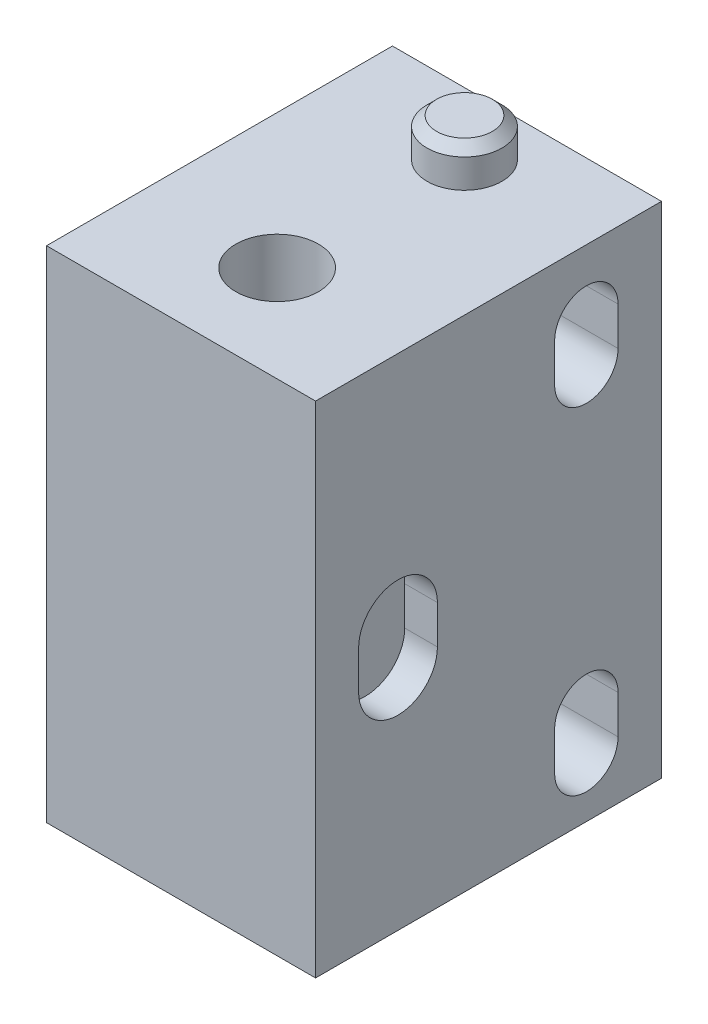
ISO-10303-21;
HEADER;
FILE_DESCRIPTION(('STEP AP214'),'2;1');
FILE_NAME('part.step','',(''),(''),'','','');
FILE_SCHEMA(('AUTOMOTIVE_DESIGN { 1 0 10303 214 1 1 1 1 }'));
ENDSEC;
DATA;
#1=APPLICATION_CONTEXT('core data for automotive mechanical design processes');
#2=APPLICATION_PROTOCOL_DEFINITION('international standard','automotive_design',2000,#1);
#3=PRODUCT_CONTEXT('',#1,'mechanical');
#4=PRODUCT('Part','Part','',(#3));
#5=PRODUCT_RELATED_PRODUCT_CATEGORY('part','',(#4));
#6=PRODUCT_DEFINITION_FORMATION('','',#4);
#7=PRODUCT_DEFINITION_CONTEXT('part definition',#1,'design');
#8=PRODUCT_DEFINITION('design','',#6,#7);
#9=PRODUCT_DEFINITION_SHAPE('','',#8);
#10=(LENGTH_UNIT() NAMED_UNIT(*) SI_UNIT(.MILLI.,.METRE.));
#11=(NAMED_UNIT(*) PLANE_ANGLE_UNIT() SI_UNIT($,.RADIAN.));
#12=(NAMED_UNIT(*) SI_UNIT($,.STERADIAN.) SOLID_ANGLE_UNIT());
#13=UNCERTAINTY_MEASURE_WITH_UNIT(LENGTH_MEASURE(1.E-05),#10,'distance_accuracy_value','');
#14=(GEOMETRIC_REPRESENTATION_CONTEXT(3) GLOBAL_UNCERTAINTY_ASSIGNED_CONTEXT((#13)) GLOBAL_UNIT_ASSIGNED_CONTEXT((#10,
#11,#12)) REPRESENTATION_CONTEXT('',''));
#15=CARTESIAN_POINT('',(0.,0.,0.));
#16=DIRECTION('',(0.,0.,1.));
#17=DIRECTION('',(1.,0.,0.));
#18=AXIS2_PLACEMENT_3D('',#15,#16,#17);
#19=CARTESIAN_POINT('',(19.,11.75,0.71));
#20=DIRECTION('',(-1.,0.,0.));
#21=DIRECTION('',(0.,0.,1.));
#22=AXIS2_PLACEMENT_3D('',#19,#20,#21);
#23=CYLINDRICAL_SURFACE('',#22,2.05);
#24=CARTESIAN_POINT('',(5.3,11.75,0.71));
#25=DIRECTION('',(-1.,0.,0.));
#26=DIRECTION('',(0.,0.,1.));
#27=AXIS2_PLACEMENT_3D('',#24,#25,#26);
#28=CIRCLE('',#27,2.05);
#29=CARTESIAN_POINT('',(5.3,11.75,-1.34));
#30=VERTEX_POINT('',#29);
#31=CARTESIAN_POINT('',(5.3,11.75,2.76));
#32=VERTEX_POINT('',#31);
#33=EDGE_CURVE('E185',#30,#32,#28,.T.);
#34=ORIENTED_EDGE('',*,*,#33,.T.);
#35=DIRECTION('',(-1.,0.,0.));
#36=VECTOR('',#35,1.);
#37=CARTESIAN_POINT('',(19.,11.75,2.76));
#38=LINE('',#37,#36);
#39=CARTESIAN_POINT('',(7.,11.75,2.76));
#40=VERTEX_POINT('',#39);
#41=EDGE_CURVE('E170',#40,#32,#38,.T.);
#42=ORIENTED_EDGE('',*,*,#41,.F.);
#43=CARTESIAN_POINT('',(7.,11.75,0.71));
#44=DIRECTION('',(-1.,0.,0.));
#45=DIRECTION('',(0.,0.,1.));
#46=AXIS2_PLACEMENT_3D('',#43,#44,#45);
#47=CIRCLE('',#46,2.05);
#48=CARTESIAN_POINT('',(7.,11.75,-1.34));
#49=VERTEX_POINT('',#48);
#50=EDGE_CURVE('E321',#49,#40,#47,.T.);
#51=ORIENTED_EDGE('',*,*,#50,.F.);
#52=DIRECTION('',(-1.,0.,0.));
#53=VECTOR('',#52,1.);
#54=CARTESIAN_POINT('',(19.,11.75,-1.34));
#55=LINE('',#54,#53);
#56=EDGE_CURVE('E222',#49,#30,#55,.T.);
#57=ORIENTED_EDGE('',*,*,#56,.T.);
#58=EDGE_LOOP('',(#34,#42,#51,#57));
#59=FACE_BOUND('',#58,.T.);
#60=ADVANCED_FACE('F19',(#59),#23,.F.);
#61=CARTESIAN_POINT('',(-5.3,11.75,0.71));
#62=DIRECTION('',(1.,0.,0.));
#63=DIRECTION('',(0.,0.,-1.));
#64=AXIS2_PLACEMENT_3D('',#61,#62,#63);
#65=CIRCLE('',#64,2.05);
#66=CARTESIAN_POINT('',(-5.3,11.75,-1.34));
#67=VERTEX_POINT('',#66);
#68=CARTESIAN_POINT('',(-5.3,11.75,2.76));
#69=VERTEX_POINT('',#68);
#70=EDGE_CURVE('E183',#67,#69,#65,.F.);
#71=ORIENTED_EDGE('',*,*,#70,.F.);
#72=CARTESIAN_POINT('',(-7.,11.75,-1.34));
#73=VERTEX_POINT('',#72);
#74=EDGE_CURVE('E248',#67,#73,#55,.T.);
#75=ORIENTED_EDGE('',*,*,#74,.T.);
#76=CARTESIAN_POINT('',(-7.,11.75,0.71));
#77=DIRECTION('',(-1.,0.,0.));
#78=DIRECTION('',(0.,0.,1.));
#79=AXIS2_PLACEMENT_3D('',#76,#77,#78);
#80=CIRCLE('',#79,2.05);
#81=CARTESIAN_POINT('',(-7.,11.75,2.76));
#82=VERTEX_POINT('',#81);
#83=EDGE_CURVE('E193',#73,#82,#80,.T.);
#84=ORIENTED_EDGE('',*,*,#83,.T.);
#85=EDGE_CURVE('E247',#69,#82,#38,.T.);
#86=ORIENTED_EDGE('',*,*,#85,.F.);
#87=EDGE_LOOP('',(#71,#75,#84,#86));
#88=FACE_BOUND('',#87,.T.);
#89=ADVANCED_FACE('F367',(#88),#23,.F.);
#90=CARTESIAN_POINT('',(19.,13.75,0.71));
#91=DIRECTION('',(-1.,0.,0.));
#92=DIRECTION('',(0.,0.,1.));
#93=AXIS2_PLACEMENT_3D('',#90,#91,#92);
#94=CYLINDRICAL_SURFACE('',#93,2.05);
#95=CARTESIAN_POINT('',(5.3,13.75,0.71));
#96=DIRECTION('',(-1.,0.,0.));
#97=DIRECTION('',(0.,0.,1.));
#98=AXIS2_PLACEMENT_3D('',#95,#96,#97);
#99=CIRCLE('',#98,2.05);
#100=CARTESIAN_POINT('',(5.3,13.75,2.76));
#101=VERTEX_POINT('',#100);
#102=CARTESIAN_POINT('',(5.3,13.75,-1.34));
#103=VERTEX_POINT('',#102);
#104=EDGE_CURVE('E34',#101,#103,#99,.T.);
#105=ORIENTED_EDGE('',*,*,#104,.T.);
#106=DIRECTION('',(-1.,0.,0.));
#107=VECTOR('',#106,1.);
#108=CARTESIAN_POINT('',(19.,13.75,-1.34));
#109=LINE('',#108,#107);
#110=CARTESIAN_POINT('',(7.,13.75,-1.34));
#111=VERTEX_POINT('',#110);
#112=EDGE_CURVE('E250',#111,#103,#109,.T.);
#113=ORIENTED_EDGE('',*,*,#112,.F.);
#114=CARTESIAN_POINT('',(7.,13.75,0.71));
#115=DIRECTION('',(-1.,0.,0.));
#116=DIRECTION('',(0.,0.,1.));
#117=AXIS2_PLACEMENT_3D('',#114,#115,#116);
#118=CIRCLE('',#117,2.05);
#119=CARTESIAN_POINT('',(7.,13.75,2.76));
#120=VERTEX_POINT('',#119);
#121=EDGE_CURVE('E318',#120,#111,#118,.T.);
#122=ORIENTED_EDGE('',*,*,#121,.F.);
#123=DIRECTION('',(-1.,0.,0.));
#124=VECTOR('',#123,1.);
#125=CARTESIAN_POINT('',(19.,13.75,2.76));
#126=LINE('',#125,#124);
#127=EDGE_CURVE('E169',#120,#101,#126,.T.);
#128=ORIENTED_EDGE('',*,*,#127,.T.);
#129=EDGE_LOOP('',(#105,#113,#122,#128));
#130=FACE_BOUND('',#129,.T.);
#131=ADVANCED_FACE('F374',(#130),#94,.F.);
#132=CARTESIAN_POINT('',(-5.3,13.75,0.71));
#133=DIRECTION('',(1.,0.,0.));
#134=DIRECTION('',(0.,0.,-1.));
#135=AXIS2_PLACEMENT_3D('',#132,#133,#134);
#136=CIRCLE('',#135,2.05);
#137=CARTESIAN_POINT('',(-5.3,13.75,2.76));
#138=VERTEX_POINT('',#137);
#139=CARTESIAN_POINT('',(-5.3,13.75,-1.34));
#140=VERTEX_POINT('',#139);
#141=EDGE_CURVE('E174',#138,#140,#136,.F.);
#142=ORIENTED_EDGE('',*,*,#141,.F.);
#143=CARTESIAN_POINT('',(-7.,13.75,2.76));
#144=VERTEX_POINT('',#143);
#145=EDGE_CURVE('E158',#138,#144,#126,.T.);
#146=ORIENTED_EDGE('',*,*,#145,.T.);
#147=CARTESIAN_POINT('',(-7.,13.75,0.71));
#148=DIRECTION('',(-1.,0.,0.));
#149=DIRECTION('',(0.,0.,1.));
#150=AXIS2_PLACEMENT_3D('',#147,#148,#149);
#151=CIRCLE('',#150,2.05);
#152=CARTESIAN_POINT('',(-7.,13.75,-1.34));
#153=VERTEX_POINT('',#152);
#154=EDGE_CURVE('E242',#144,#153,#151,.T.);
#155=ORIENTED_EDGE('',*,*,#154,.T.);
#156=EDGE_CURVE('E176',#140,#153,#109,.T.);
#157=ORIENTED_EDGE('',*,*,#156,.F.);
#158=EDGE_LOOP('',(#142,#146,#155,#157));
#159=FACE_BOUND('',#158,.T.);
#160=ADVANCED_FACE('F175',(#159),#94,.F.);
#161=CARTESIAN_POINT('',(19.,11.75,-1.34));
#162=DIRECTION('',(0.,0.,-1.));
#163=DIRECTION('',(0.,1.,0.));
#164=AXIS2_PLACEMENT_3D('',#161,#162,#163);
#165=PLANE('',#164);
#166=DIRECTION('',(0.,-1.,0.));
#167=VECTOR('',#166,1.);
#168=CARTESIAN_POINT('',(5.3,13.75,-1.34));
#169=LINE('',#168,#167);
#170=EDGE_CURVE('E41',#103,#30,#169,.T.);
#171=ORIENTED_EDGE('',*,*,#170,.T.);
#172=ORIENTED_EDGE('',*,*,#56,.F.);
#173=DIRECTION('',(0.,-1.,0.));
#174=VECTOR('',#173,1.);
#175=CARTESIAN_POINT('',(7.,26.,-1.34));
#176=LINE('',#175,#174);
#177=EDGE_CURVE('E254',#111,#49,#176,.T.);
#178=ORIENTED_EDGE('',*,*,#177,.F.);
#179=ORIENTED_EDGE('',*,*,#112,.T.);
#180=EDGE_LOOP('',(#171,#172,#178,#179));
#181=FACE_BOUND('',#180,.T.);
#182=ADVANCED_FACE('F581',(#181),#165,.F.);
#183=DIRECTION('',(0.,-1.,0.));
#184=VECTOR('',#183,1.);
#185=CARTESIAN_POINT('',(-5.3,13.75,-1.34));
#186=LINE('',#185,#184);
#187=EDGE_CURVE('E179',#140,#67,#186,.T.);
#188=ORIENTED_EDGE('',*,*,#187,.F.);
#189=ORIENTED_EDGE('',*,*,#156,.T.);
#190=DIRECTION('',(0.,-1.,0.));
#191=VECTOR('',#190,1.);
#192=CARTESIAN_POINT('',(-7.,11.75,-1.34));
#193=LINE('',#192,#191);
#194=EDGE_CURVE('E244',#153,#73,#193,.T.);
#195=ORIENTED_EDGE('',*,*,#194,.T.);
#196=ORIENTED_EDGE('',*,*,#74,.F.);
#197=EDGE_LOOP('',(#188,#189,#195,#196));
#198=FACE_BOUND('',#197,.T.);
#199=ADVANCED_FACE('F587',(#198),#165,.F.);
#200=CARTESIAN_POINT('',(19.,11.75,2.76));
#201=DIRECTION('',(0.,0.,1.));
#202=DIRECTION('',(0.,-1.,0.));
#203=AXIS2_PLACEMENT_3D('',#200,#201,#202);
#204=PLANE('',#203);
#205=DIRECTION('',(0.,1.,0.));
#206=VECTOR('',#205,1.);
#207=CARTESIAN_POINT('',(5.3,11.75,2.76));
#208=LINE('',#207,#206);
#209=EDGE_CURVE('E191',#32,#101,#208,.T.);
#210=ORIENTED_EDGE('',*,*,#209,.T.);
#211=ORIENTED_EDGE('',*,*,#127,.F.);
#212=DIRECTION('',(0.,1.,0.));
#213=VECTOR('',#212,1.);
#214=CARTESIAN_POINT('',(7.,26.,2.76));
#215=LINE('',#214,#213);
#216=EDGE_CURVE('E211',#40,#120,#215,.T.);
#217=ORIENTED_EDGE('',*,*,#216,.F.);
#218=ORIENTED_EDGE('',*,*,#41,.T.);
#219=EDGE_LOOP('',(#210,#211,#217,#218));
#220=FACE_BOUND('',#219,.T.);
#221=ADVANCED_FACE('F378',(#220),#204,.F.);
#222=DIRECTION('',(0.,1.,0.));
#223=VECTOR('',#222,1.);
#224=CARTESIAN_POINT('',(-5.3,11.75,2.76));
#225=LINE('',#224,#223);
#226=EDGE_CURVE('E162',#69,#138,#225,.T.);
#227=ORIENTED_EDGE('',*,*,#226,.F.);
#228=ORIENTED_EDGE('',*,*,#85,.T.);
#229=DIRECTION('',(0.,1.,0.));
#230=VECTOR('',#229,1.);
#231=CARTESIAN_POINT('',(-7.,11.75,2.76));
#232=LINE('',#231,#230);
#233=EDGE_CURVE('E165',#82,#144,#232,.T.);
#234=ORIENTED_EDGE('',*,*,#233,.T.);
#235=ORIENTED_EDGE('',*,*,#145,.F.);
#236=EDGE_LOOP('',(#227,#228,#234,#235));
#237=FACE_BOUND('',#236,.T.);
#238=ADVANCED_FACE('F160',(#237),#204,.F.);
#239=CARTESIAN_POINT('',(0.,26.,0.));
#240=DIRECTION('',(0.,-1.,0.));
#241=DIRECTION('',(0.,0.,-1.));
#242=AXIS2_PLACEMENT_3D('',#239,#240,#241);
#243=CYLINDRICAL_SURFACE('',#242,2.15);
#244=CARTESIAN_POINT('',(0.,0.,0.));
#245=DIRECTION('',(0.,1.,0.));
#246=DIRECTION('',(0.,0.,1.));
#247=AXIS2_PLACEMENT_3D('',#244,#245,#246);
#248=CIRCLE('',#247,2.15);
#249=CARTESIAN_POINT('',(0.,0.,2.15));
#250=VERTEX_POINT('',#249);
#251=EDGE_CURVE('E274',#250,#250,#248,.T.);
#252=ORIENTED_EDGE('',*,*,#251,.F.);
#253=EDGE_LOOP('',(#252));
#254=FACE_BOUND('',#253,.T.);
#255=CARTESIAN_POINT('',(0.,26.,0.));
#256=DIRECTION('',(0.,1.,0.));
#257=DIRECTION('',(0.,0.,1.));
#258=AXIS2_PLACEMENT_3D('',#255,#256,#257);
#259=CIRCLE('',#258,2.15);
#260=CARTESIAN_POINT('',(0.,26.,2.15));
#261=VERTEX_POINT('',#260);
#262=EDGE_CURVE('E270',#261,#261,#259,.T.);
#263=ORIENTED_EDGE('',*,*,#262,.T.);
#264=EDGE_LOOP('',(#263));
#265=FACE_BOUND('',#264,.T.);
#266=ADVANCED_FACE('F395',(#254,#265),#243,.F.);
#267=CARTESIAN_POINT('',(0.,26.,0.));
#268=DIRECTION('',(0.,1.,0.));
#269=DIRECTION('',(0.,0.,1.));
#270=AXIS2_PLACEMENT_3D('',#267,#268,#269);
#271=PLANE('',#270);
#272=CARTESIAN_POINT('',(0.,26.,-9.75));
#273=DIRECTION('',(0.,1.,0.));
#274=DIRECTION('',(0.,0.,1.));
#275=AXIS2_PLACEMENT_3D('',#272,#273,#274);
#276=CIRCLE('',#275,1.95);
#277=CARTESIAN_POINT('',(0.,26.,-7.8));
#278=VERTEX_POINT('',#277);
#279=EDGE_CURVE('E265',#278,#278,#276,.T.);
#280=ORIENTED_EDGE('',*,*,#279,.F.);
#281=EDGE_LOOP('',(#280));
#282=FACE_BOUND('',#281,.T.);
#283=DIRECTION('',(0.,0.,1.));
#284=VECTOR('',#283,1.);
#285=CARTESIAN_POINT('',(-7.,26.,-13.));
#286=LINE('',#285,#284);
#287=CARTESIAN_POINT('',(-7.,26.,-13.));
#288=VERTEX_POINT('',#287);
#289=CARTESIAN_POINT('',(-7.,26.,5.));
#290=VERTEX_POINT('',#289);
#291=EDGE_CURVE('E277',#288,#290,#286,.T.);
#292=ORIENTED_EDGE('',*,*,#291,.T.);
#293=DIRECTION('',(1.,0.,0.));
#294=VECTOR('',#293,1.);
#295=CARTESIAN_POINT('',(-7.,26.,5.));
#296=LINE('',#295,#294);
#297=CARTESIAN_POINT('',(7.,26.,5.));
#298=VERTEX_POINT('',#297);
#299=EDGE_CURVE('E280',#290,#298,#296,.T.);
#300=ORIENTED_EDGE('',*,*,#299,.T.);
#301=DIRECTION('',(0.,0.,-1.));
#302=VECTOR('',#301,1.);
#303=CARTESIAN_POINT('',(7.,26.,-13.));
#304=LINE('',#303,#302);
#305=CARTESIAN_POINT('',(7.,26.,-13.));
#306=VERTEX_POINT('',#305);
#307=EDGE_CURVE('E283',#298,#306,#304,.T.);
#308=ORIENTED_EDGE('',*,*,#307,.T.);
#309=DIRECTION('',(-1.,0.,0.));
#310=VECTOR('',#309,1.);
#311=CARTESIAN_POINT('',(-7.,26.,-13.));
#312=LINE('',#311,#310);
#313=EDGE_CURVE('E285',#306,#288,#312,.T.);
#314=ORIENTED_EDGE('',*,*,#313,.T.);
#315=EDGE_LOOP('',(#292,#300,#308,#314));
#316=FACE_BOUND('',#315,.T.);
#317=ORIENTED_EDGE('',*,*,#262,.F.);
#318=EDGE_LOOP('',(#317));
#319=FACE_BOUND('',#318,.T.);
#320=ADVANCED_FACE('F398',(#282,#316,#319),#271,.T.);
#321=CARTESIAN_POINT('',(0.,0.,0.));
#322=DIRECTION('',(0.,1.,0.));
#323=DIRECTION('',(0.,0.,1.));
#324=AXIS2_PLACEMENT_3D('',#321,#322,#323);
#325=PLANE('',#324);
#326=CARTESIAN_POINT('',(0.,0.,-9.75));
#327=DIRECTION('',(0.,1.,0.));
#328=DIRECTION('',(0.,0.,1.));
#329=AXIS2_PLACEMENT_3D('',#326,#327,#328);
#330=CIRCLE('',#329,1.95);
#331=CARTESIAN_POINT('',(0.,0.,-7.8));
#332=VERTEX_POINT('',#331);
#333=EDGE_CURVE('E264',#332,#332,#330,.T.);
#334=ORIENTED_EDGE('',*,*,#333,.T.);
#335=EDGE_LOOP('',(#334));
#336=FACE_BOUND('',#335,.T.);
#337=DIRECTION('',(0.,0.,1.));
#338=VECTOR('',#337,1.);
#339=CARTESIAN_POINT('',(-7.,0.,-13.));
#340=LINE('',#339,#338);
#341=CARTESIAN_POINT('',(-7.,0.,-13.));
#342=VERTEX_POINT('',#341);
#343=CARTESIAN_POINT('',(-7.,0.,5.));
#344=VERTEX_POINT('',#343);
#345=EDGE_CURVE('E273',#342,#344,#340,.T.);
#346=ORIENTED_EDGE('',*,*,#345,.F.);
#347=DIRECTION('',(-1.,0.,0.));
#348=VECTOR('',#347,1.);
#349=CARTESIAN_POINT('',(-7.,0.,-13.));
#350=LINE('',#349,#348);
#351=CARTESIAN_POINT('',(7.,0.,-13.));
#352=VERTEX_POINT('',#351);
#353=EDGE_CURVE('E281',#352,#342,#350,.T.);
#354=ORIENTED_EDGE('',*,*,#353,.F.);
#355=DIRECTION('',(0.,0.,-1.));
#356=VECTOR('',#355,1.);
#357=CARTESIAN_POINT('',(7.,0.,-13.));
#358=LINE('',#357,#356);
#359=CARTESIAN_POINT('',(7.,0.,5.));
#360=VERTEX_POINT('',#359);
#361=EDGE_CURVE('E292',#360,#352,#358,.T.);
#362=ORIENTED_EDGE('',*,*,#361,.F.);
#363=DIRECTION('',(1.,0.,0.));
#364=VECTOR('',#363,1.);
#365=CARTESIAN_POINT('',(-7.,0.,5.));
#366=LINE('',#365,#364);
#367=EDGE_CURVE('E290',#344,#360,#366,.T.);
#368=ORIENTED_EDGE('',*,*,#367,.F.);
#369=EDGE_LOOP('',(#346,#354,#362,#368));
#370=FACE_BOUND('',#369,.T.);
#371=ORIENTED_EDGE('',*,*,#251,.T.);
#372=EDGE_LOOP('',(#371));
#373=FACE_BOUND('',#372,.T.);
#374=ADVANCED_FACE('F402',(#336,#370,#373),#325,.F.);
#375=CARTESIAN_POINT('',(-7.,26.,-13.));
#376=DIRECTION('',(1.,0.,0.));
#377=DIRECTION('',(0.,0.,-1.));
#378=AXIS2_PLACEMENT_3D('',#375,#376,#377);
#379=PLANE('',#378);
#380=ORIENTED_EDGE('',*,*,#233,.F.);
#381=ORIENTED_EDGE('',*,*,#83,.F.);
#382=ORIENTED_EDGE('',*,*,#194,.F.);
#383=ORIENTED_EDGE('',*,*,#154,.F.);
#384=EDGE_LOOP('',(#380,#381,#382,#383));
#385=FACE_BOUND('',#384,.T.);
#386=DIRECTION('',(0.,1.,0.));
#387=VECTOR('',#386,1.);
#388=CARTESIAN_POINT('',(-7.,3.,-7.44));
#389=LINE('',#388,#387);
#390=CARTESIAN_POINT('',(-7.,3.,-7.44));
#391=VERTEX_POINT('',#390);
#392=CARTESIAN_POINT('',(-7.,5.,-7.44));
#393=VERTEX_POINT('',#392);
#394=EDGE_CURVE('E198',#391,#393,#389,.T.);
#395=ORIENTED_EDGE('',*,*,#394,.F.);
#396=CARTESIAN_POINT('',(-7.,3.,-9.09));
#397=DIRECTION('',(-1.,0.,0.));
#398=DIRECTION('',(0.,0.,1.));
#399=AXIS2_PLACEMENT_3D('',#396,#397,#398);
#400=CIRCLE('',#399,1.65);
#401=CARTESIAN_POINT('',(-7.,3.,-10.74));
#402=VERTEX_POINT('',#401);
#403=EDGE_CURVE('E195',#402,#391,#400,.T.);
#404=ORIENTED_EDGE('',*,*,#403,.F.);
#405=DIRECTION('',(0.,-1.,0.));
#406=VECTOR('',#405,1.);
#407=CARTESIAN_POINT('',(-7.,3.,-10.74));
#408=LINE('',#407,#406);
#409=CARTESIAN_POINT('',(-7.,5.,-10.74));
#410=VERTEX_POINT('',#409);
#411=EDGE_CURVE('E205',#410,#402,#408,.T.);
#412=ORIENTED_EDGE('',*,*,#411,.F.);
#413=CARTESIAN_POINT('',(-7.,5.,-9.09));
#414=DIRECTION('',(-1.,0.,0.));
#415=DIRECTION('',(0.,0.,1.));
#416=AXIS2_PLACEMENT_3D('',#413,#414,#415);
#417=CIRCLE('',#416,1.65);
#418=EDGE_CURVE('E202',#393,#410,#417,.T.);
#419=ORIENTED_EDGE('',*,*,#418,.F.);
#420=EDGE_LOOP('',(#395,#404,#412,#419));
#421=FACE_BOUND('',#420,.T.);
#422=DIRECTION('',(0.,1.,0.));
#423=VECTOR('',#422,1.);
#424=CARTESIAN_POINT('',(-7.,20.5,-7.44));
#425=LINE('',#424,#423);
#426=CARTESIAN_POINT('',(-7.,20.5,-7.44));
#427=VERTEX_POINT('',#426);
#428=CARTESIAN_POINT('',(-7.,22.5,-7.44));
#429=VERTEX_POINT('',#428);
#430=EDGE_CURVE('E221',#427,#429,#425,.T.);
#431=ORIENTED_EDGE('',*,*,#430,.F.);
#432=CARTESIAN_POINT('',(-7.,20.5,-9.09));
#433=DIRECTION('',(-1.,0.,0.));
#434=DIRECTION('',(0.,0.,1.));
#435=AXIS2_PLACEMENT_3D('',#432,#433,#434);
#436=CIRCLE('',#435,1.65);
#437=CARTESIAN_POINT('',(-7.,20.5,-10.74));
#438=VERTEX_POINT('',#437);
#439=EDGE_CURVE('E218',#438,#427,#436,.T.);
#440=ORIENTED_EDGE('',*,*,#439,.F.);
#441=DIRECTION('',(0.,-1.,0.));
#442=VECTOR('',#441,1.);
#443=CARTESIAN_POINT('',(-7.,20.5,-10.74));
#444=LINE('',#443,#442);
#445=CARTESIAN_POINT('',(-7.,22.5,-10.74));
#446=VERTEX_POINT('',#445);
#447=EDGE_CURVE('E228',#446,#438,#444,.T.);
#448=ORIENTED_EDGE('',*,*,#447,.F.);
#449=CARTESIAN_POINT('',(-7.,22.5,-9.09));
#450=DIRECTION('',(-1.,0.,0.));
#451=DIRECTION('',(0.,0.,1.));
#452=AXIS2_PLACEMENT_3D('',#449,#450,#451);
#453=CIRCLE('',#452,1.65);
#454=EDGE_CURVE('E225',#429,#446,#453,.T.);
#455=ORIENTED_EDGE('',*,*,#454,.F.);
#456=EDGE_LOOP('',(#431,#440,#448,#455));
#457=FACE_BOUND('',#456,.T.);
#458=ORIENTED_EDGE('',*,*,#345,.T.);
#459=DIRECTION('',(0.,-1.,0.));
#460=VECTOR('',#459,1.);
#461=CARTESIAN_POINT('',(-7.,26.,5.));
#462=LINE('',#461,#460);
#463=EDGE_CURVE('E269',#290,#344,#462,.T.);
#464=ORIENTED_EDGE('',*,*,#463,.F.);
#465=ORIENTED_EDGE('',*,*,#291,.F.);
#466=DIRECTION('',(0.,-1.,0.));
#467=VECTOR('',#466,1.);
#468=CARTESIAN_POINT('',(-7.,26.,-13.));
#469=LINE('',#468,#467);
#470=EDGE_CURVE('E287',#288,#342,#469,.T.);
#471=ORIENTED_EDGE('',*,*,#470,.T.);
#472=EDGE_LOOP('',(#458,#464,#465,#471));
#473=FACE_BOUND('',#472,.T.);
#474=ADVANCED_FACE('F349',(#385,#421,#457,#473),#379,.F.);
#475=CARTESIAN_POINT('',(-7.,26.,5.));
#476=DIRECTION('',(0.,0.,-1.));
#477=DIRECTION('',(-1.,0.,0.));
#478=AXIS2_PLACEMENT_3D('',#475,#476,#477);
#479=PLANE('',#478);
#480=ORIENTED_EDGE('',*,*,#367,.T.);
#481=DIRECTION('',(0.,-1.,0.));
#482=VECTOR('',#481,1.);
#483=CARTESIAN_POINT('',(7.,26.,5.));
#484=LINE('',#483,#482);
#485=EDGE_CURVE('E300',#298,#360,#484,.T.);
#486=ORIENTED_EDGE('',*,*,#485,.F.);
#487=ORIENTED_EDGE('',*,*,#299,.F.);
#488=ORIENTED_EDGE('',*,*,#463,.T.);
#489=EDGE_LOOP('',(#480,#486,#487,#488));
#490=FACE_BOUND('',#489,.T.);
#491=ADVANCED_FACE('F412',(#490),#479,.F.);
#492=CARTESIAN_POINT('',(7.,26.,-13.));
#493=DIRECTION('',(-1.,0.,0.));
#494=DIRECTION('',(0.,0.,1.));
#495=AXIS2_PLACEMENT_3D('',#492,#493,#494);
#496=PLANE('',#495);
#497=ORIENTED_EDGE('',*,*,#177,.T.);
#498=ORIENTED_EDGE('',*,*,#50,.T.);
#499=ORIENTED_EDGE('',*,*,#216,.T.);
#500=ORIENTED_EDGE('',*,*,#121,.T.);
#501=EDGE_LOOP('',(#497,#498,#499,#500));
#502=FACE_BOUND('',#501,.T.);
#503=DIRECTION('',(0.,-1.,0.));
#504=VECTOR('',#503,1.);
#505=CARTESIAN_POINT('',(7.,26.,-10.74));
#506=LINE('',#505,#504);
#507=CARTESIAN_POINT('',(7.,5.,-10.74));
#508=VERTEX_POINT('',#507);
#509=CARTESIAN_POINT('',(7.,3.,-10.74));
#510=VERTEX_POINT('',#509);
#511=EDGE_CURVE('E258',#508,#510,#506,.T.);
#512=ORIENTED_EDGE('',*,*,#511,.T.);
#513=CARTESIAN_POINT('',(7.,3.,-9.09));
#514=DIRECTION('',(-1.,0.,0.));
#515=DIRECTION('',(0.,0.,1.));
#516=AXIS2_PLACEMENT_3D('',#513,#514,#515);
#517=CIRCLE('',#516,1.65);
#518=CARTESIAN_POINT('',(7.,3.,-7.44));
#519=VERTEX_POINT('',#518);
#520=EDGE_CURVE('E12',#510,#519,#517,.T.);
#521=ORIENTED_EDGE('',*,*,#520,.T.);
#522=DIRECTION('',(0.,1.,0.));
#523=VECTOR('',#522,1.);
#524=CARTESIAN_POINT('',(7.,26.,-7.44));
#525=LINE('',#524,#523);
#526=CARTESIAN_POINT('',(7.,5.,-7.44));
#527=VERTEX_POINT('',#526);
#528=EDGE_CURVE('E256',#519,#527,#525,.T.);
#529=ORIENTED_EDGE('',*,*,#528,.T.);
#530=CARTESIAN_POINT('',(7.,5.,-9.09));
#531=DIRECTION('',(-1.,0.,0.));
#532=DIRECTION('',(0.,0.,1.));
#533=AXIS2_PLACEMENT_3D('',#530,#531,#532);
#534=CIRCLE('',#533,1.65);
#535=EDGE_CURVE('E27',#527,#508,#534,.T.);
#536=ORIENTED_EDGE('',*,*,#535,.T.);
#537=EDGE_LOOP('',(#512,#521,#529,#536));
#538=FACE_BOUND('',#537,.T.);
#539=DIRECTION('',(0.,-1.,0.));
#540=VECTOR('',#539,1.);
#541=CARTESIAN_POINT('',(7.,26.,-10.74));
#542=LINE('',#541,#540);
#543=CARTESIAN_POINT('',(7.,22.5,-10.74));
#544=VERTEX_POINT('',#543);
#545=CARTESIAN_POINT('',(7.,20.5,-10.74));
#546=VERTEX_POINT('',#545);
#547=EDGE_CURVE('E262',#544,#546,#542,.T.);
#548=ORIENTED_EDGE('',*,*,#547,.T.);
#549=CARTESIAN_POINT('',(7.,20.5,-9.09));
#550=DIRECTION('',(-1.,0.,0.));
#551=DIRECTION('',(0.,0.,1.));
#552=AXIS2_PLACEMENT_3D('',#549,#550,#551);
#553=CIRCLE('',#552,1.65);
#554=CARTESIAN_POINT('',(7.,20.5,-7.44));
#555=VERTEX_POINT('',#554);
#556=EDGE_CURVE('E327',#546,#555,#553,.T.);
#557=ORIENTED_EDGE('',*,*,#556,.T.);
#558=DIRECTION('',(0.,1.,0.));
#559=VECTOR('',#558,1.);
#560=CARTESIAN_POINT('',(7.,26.,-7.44));
#561=LINE('',#560,#559);
#562=CARTESIAN_POINT('',(7.,22.5,-7.44));
#563=VERTEX_POINT('',#562);
#564=EDGE_CURVE('E260',#555,#563,#561,.T.);
#565=ORIENTED_EDGE('',*,*,#564,.T.);
#566=CARTESIAN_POINT('',(7.,22.5,-9.09));
#567=DIRECTION('',(-1.,0.,0.));
#568=DIRECTION('',(0.,0.,1.));
#569=AXIS2_PLACEMENT_3D('',#566,#567,#568);
#570=CIRCLE('',#569,1.65);
#571=EDGE_CURVE('E324',#563,#544,#570,.T.);
#572=ORIENTED_EDGE('',*,*,#571,.T.);
#573=EDGE_LOOP('',(#548,#557,#565,#572));
#574=FACE_BOUND('',#573,.T.);
#575=ORIENTED_EDGE('',*,*,#361,.T.);
#576=DIRECTION('',(0.,-1.,0.));
#577=VECTOR('',#576,1.);
#578=CARTESIAN_POINT('',(7.,26.,-13.));
#579=LINE('',#578,#577);
#580=EDGE_CURVE('E297',#306,#352,#579,.T.);
#581=ORIENTED_EDGE('',*,*,#580,.F.);
#582=ORIENTED_EDGE('',*,*,#307,.F.);
#583=ORIENTED_EDGE('',*,*,#485,.T.);
#584=EDGE_LOOP('',(#575,#581,#582,#583));
#585=FACE_BOUND('',#584,.T.);
#586=ADVANCED_FACE('F332',(#502,#538,#574,#585),#496,.F.);
#587=CARTESIAN_POINT('',(-7.,26.,-13.));
#588=DIRECTION('',(0.,0.,1.));
#589=DIRECTION('',(1.,0.,0.));
#590=AXIS2_PLACEMENT_3D('',#587,#588,#589);
#591=PLANE('',#590);
#592=ORIENTED_EDGE('',*,*,#353,.T.);
#593=ORIENTED_EDGE('',*,*,#470,.F.);
#594=ORIENTED_EDGE('',*,*,#313,.F.);
#595=ORIENTED_EDGE('',*,*,#580,.T.);
#596=EDGE_LOOP('',(#592,#593,#594,#595));
#597=FACE_BOUND('',#596,.T.);
#598=ADVANCED_FACE('F390',(#597),#591,.F.);
#599=CARTESIAN_POINT('',(0.,-2.,0.));
#600=DIRECTION('',(0.,1.,0.));
#601=DIRECTION('',(0.,0.,1.));
#602=AXIS2_PLACEMENT_3D('',#599,#600,#601);
#603=PLANE('',#602);
#604=CARTESIAN_POINT('',(0.,-2.,-9.75));
#605=DIRECTION('',(0.,1.,0.));
#606=DIRECTION('',(0.,0.,1.));
#607=AXIS2_PLACEMENT_3D('',#604,#605,#606);
#608=CIRCLE('',#607,1.45);
#609=CARTESIAN_POINT('',(0.,-2.,-8.3));
#610=VERTEX_POINT('',#609);
#611=EDGE_CURVE('E268',#610,#610,#608,.F.);
#612=ORIENTED_EDGE('',*,*,#611,.T.);
#613=EDGE_LOOP('',(#612));
#614=FACE_BOUND('',#613,.T.);
#615=ADVANCED_FACE('F386',(#614),#603,.F.);
#616=CARTESIAN_POINT('',(0.,-9.51543289325507,-9.75));
#617=DIRECTION('',(0.,1.,0.));
#618=DIRECTION('',(0.,0.,1.));
#619=AXIS2_PLACEMENT_3D('',#616,#617,#618);
#620=CYLINDRICAL_SURFACE('',#619,1.95);
#621=CARTESIAN_POINT('',(0.,-1.5,-9.75));
#622=DIRECTION('',(0.,1.,0.));
#623=DIRECTION('',(0.,0.,1.));
#624=AXIS2_PLACEMENT_3D('',#621,#622,#623);
#625=CIRCLE('',#624,1.95);
#626=CARTESIAN_POINT('',(0.,-1.5,-7.8));
#627=VERTEX_POINT('',#626);
#628=EDGE_CURVE('E309',#627,#627,#625,.T.);
#629=ORIENTED_EDGE('',*,*,#628,.T.);
#630=EDGE_LOOP('',(#629));
#631=FACE_BOUND('',#630,.T.);
#632=ORIENTED_EDGE('',*,*,#333,.F.);
#633=EDGE_LOOP('',(#632));
#634=FACE_BOUND('',#633,.T.);
#635=ADVANCED_FACE('F389',(#631,#634),#620,.T.);
#636=CARTESIAN_POINT('',(0.,27.5,-9.75));
#637=DIRECTION('',(0.,1.,0.));
#638=DIRECTION('',(0.,0.,1.));
#639=AXIS2_PLACEMENT_3D('',#636,#637,#638);
#640=CIRCLE('',#639,1.95);
#641=CARTESIAN_POINT('',(0.,27.5,-7.8));
#642=VERTEX_POINT('',#641);
#643=EDGE_CURVE('E315',#642,#642,#640,.F.);
#644=ORIENTED_EDGE('',*,*,#643,.T.);
#645=EDGE_LOOP('',(#644));
#646=FACE_BOUND('',#645,.T.);
#647=ORIENTED_EDGE('',*,*,#279,.T.);
#648=EDGE_LOOP('',(#647));
#649=FACE_BOUND('',#648,.T.);
#650=ADVANCED_FACE('F384',(#646,#649),#620,.T.);
#651=CARTESIAN_POINT('',(0.,28.,-9.75));
#652=DIRECTION('',(0.,1.,0.));
#653=DIRECTION('',(0.,0.,1.));
#654=AXIS2_PLACEMENT_3D('',#651,#652,#653);
#655=PLANE('',#654);
#656=CARTESIAN_POINT('',(0.,28.,-9.75));
#657=DIRECTION('',(0.,1.,0.));
#658=DIRECTION('',(0.,0.,1.));
#659=AXIS2_PLACEMENT_3D('',#656,#657,#658);
#660=CIRCLE('',#659,1.45);
#661=CARTESIAN_POINT('',(0.,28.,-8.3));
#662=VERTEX_POINT('',#661);
#663=EDGE_CURVE('E312',#662,#662,#660,.T.);
#664=ORIENTED_EDGE('',*,*,#663,.T.);
#665=EDGE_LOOP('',(#664));
#666=FACE_BOUND('',#665,.T.);
#667=ADVANCED_FACE('F380',(#666),#655,.T.);
#668=CARTESIAN_POINT('',(0.,-2.,-9.75));
#669=DIRECTION('',(0.,1.,0.));
#670=DIRECTION('',(0.,0.,1.));
#671=AXIS2_PLACEMENT_3D('',#668,#669,#670);
#672=CONICAL_SURFACE('',#671,1.45,0.785398163397448);
#673=ORIENTED_EDGE('',*,*,#628,.F.);
#674=EDGE_LOOP('',(#673));
#675=FACE_BOUND('',#674,.T.);
#676=ORIENTED_EDGE('',*,*,#611,.F.);
#677=EDGE_LOOP('',(#676));
#678=FACE_BOUND('',#677,.T.);
#679=ADVANCED_FACE('F383',(#675,#678),#672,.T.);
#680=CARTESIAN_POINT('',(0.,28.,-9.75));
#681=DIRECTION('',(0.,-1.,0.));
#682=DIRECTION('',(0.,0.,-1.));
#683=AXIS2_PLACEMENT_3D('',#680,#681,#682);
#684=CONICAL_SURFACE('',#683,1.45,0.785398163397445);
#685=ORIENTED_EDGE('',*,*,#643,.F.);
#686=EDGE_LOOP('',(#685));
#687=FACE_BOUND('',#686,.T.);
#688=ORIENTED_EDGE('',*,*,#663,.F.);
#689=EDGE_LOOP('',(#688));
#690=FACE_BOUND('',#689,.T.);
#691=ADVANCED_FACE('F21',(#687,#690),#684,.T.);
#692=CARTESIAN_POINT('',(19.,20.5,-9.09));
#693=DIRECTION('',(-1.,0.,0.));
#694=DIRECTION('',(0.,0.,1.));
#695=AXIS2_PLACEMENT_3D('',#692,#693,#694);
#696=CYLINDRICAL_SURFACE('',#695,1.65);
#697=DIRECTION('',(-1.,0.,0.));
#698=VECTOR('',#697,1.);
#699=CARTESIAN_POINT('',(19.,20.5,-10.74));
#700=LINE('',#699,#698);
#701=EDGE_CURVE('E199',#546,#438,#700,.T.);
#702=ORIENTED_EDGE('',*,*,#701,.T.);
#703=ORIENTED_EDGE('',*,*,#439,.T.);
#704=DIRECTION('',(-1.,0.,0.));
#705=VECTOR('',#704,1.);
#706=CARTESIAN_POINT('',(19.,20.5,-7.44));
#707=LINE('',#706,#705);
#708=EDGE_CURVE('E230',#555,#427,#707,.T.);
#709=ORIENTED_EDGE('',*,*,#708,.F.);
#710=ORIENTED_EDGE('',*,*,#556,.F.);
#711=EDGE_LOOP('',(#702,#703,#709,#710));
#712=FACE_BOUND('',#711,.T.);
#713=ADVANCED_FACE('F425',(#712),#696,.F.);
#714=CARTESIAN_POINT('',(19.,22.5,-9.09));
#715=DIRECTION('',(-1.,0.,0.));
#716=DIRECTION('',(0.,0.,1.));
#717=AXIS2_PLACEMENT_3D('',#714,#715,#716);
#718=CYLINDRICAL_SURFACE('',#717,1.65);
#719=DIRECTION('',(-1.,0.,0.));
#720=VECTOR('',#719,1.);
#721=CARTESIAN_POINT('',(19.,22.5,-7.44));
#722=LINE('',#721,#720);
#723=EDGE_CURVE('E235',#563,#429,#722,.T.);
#724=ORIENTED_EDGE('',*,*,#723,.T.);
#725=ORIENTED_EDGE('',*,*,#454,.T.);
#726=DIRECTION('',(-1.,0.,0.));
#727=VECTOR('',#726,1.);
#728=CARTESIAN_POINT('',(19.,22.5,-10.74));
#729=LINE('',#728,#727);
#730=EDGE_CURVE('E233',#544,#446,#729,.T.);
#731=ORIENTED_EDGE('',*,*,#730,.F.);
#732=ORIENTED_EDGE('',*,*,#571,.F.);
#733=EDGE_LOOP('',(#724,#725,#731,#732));
#734=FACE_BOUND('',#733,.T.);
#735=ADVANCED_FACE('F494',(#734),#718,.F.);
#736=CARTESIAN_POINT('',(19.,20.5,-10.74));
#737=DIRECTION('',(0.,0.,-1.));
#738=DIRECTION('',(-1.,0.,0.));
#739=AXIS2_PLACEMENT_3D('',#736,#737,#738);
#740=PLANE('',#739);
#741=ORIENTED_EDGE('',*,*,#730,.T.);
#742=ORIENTED_EDGE('',*,*,#447,.T.);
#743=ORIENTED_EDGE('',*,*,#701,.F.);
#744=ORIENTED_EDGE('',*,*,#547,.F.);
#745=EDGE_LOOP('',(#741,#742,#743,#744));
#746=FACE_BOUND('',#745,.T.);
#747=ADVANCED_FACE('F504',(#746),#740,.F.);
#748=CARTESIAN_POINT('',(19.,20.5,-7.44));
#749=DIRECTION('',(0.,0.,1.));
#750=DIRECTION('',(1.,0.,0.));
#751=AXIS2_PLACEMENT_3D('',#748,#749,#750);
#752=PLANE('',#751);
#753=ORIENTED_EDGE('',*,*,#708,.T.);
#754=ORIENTED_EDGE('',*,*,#430,.T.);
#755=ORIENTED_EDGE('',*,*,#723,.F.);
#756=ORIENTED_EDGE('',*,*,#564,.F.);
#757=EDGE_LOOP('',(#753,#754,#755,#756));
#758=FACE_BOUND('',#757,.T.);
#759=ADVANCED_FACE('F514',(#758),#752,.F.);
#760=CARTESIAN_POINT('',(19.,3.,-9.09));
#761=DIRECTION('',(-1.,0.,0.));
#762=DIRECTION('',(0.,0.,1.));
#763=AXIS2_PLACEMENT_3D('',#760,#761,#762);
#764=CYLINDRICAL_SURFACE('',#763,1.65);
#765=DIRECTION('',(-1.,0.,0.));
#766=VECTOR('',#765,1.);
#767=CARTESIAN_POINT('',(19.,3.,-10.74));
#768=LINE('',#767,#766);
#769=EDGE_CURVE('E208',#510,#402,#768,.T.);
#770=ORIENTED_EDGE('',*,*,#769,.T.);
#771=ORIENTED_EDGE('',*,*,#403,.T.);
#772=DIRECTION('',(-1.,0.,0.));
#773=VECTOR('',#772,1.);
#774=CARTESIAN_POINT('',(19.,3.,-7.44));
#775=LINE('',#774,#773);
#776=EDGE_CURVE('E207',#519,#391,#775,.T.);
#777=ORIENTED_EDGE('',*,*,#776,.F.);
#778=ORIENTED_EDGE('',*,*,#520,.F.);
#779=EDGE_LOOP('',(#770,#771,#777,#778));
#780=FACE_BOUND('',#779,.T.);
#781=ADVANCED_FACE('F346',(#780),#764,.F.);
#782=CARTESIAN_POINT('',(19.,5.,-9.09));
#783=DIRECTION('',(-1.,0.,0.));
#784=DIRECTION('',(0.,0.,1.));
#785=AXIS2_PLACEMENT_3D('',#782,#783,#784);
#786=CYLINDRICAL_SURFACE('',#785,1.65);
#787=DIRECTION('',(-1.,0.,0.));
#788=VECTOR('',#787,1.);
#789=CARTESIAN_POINT('',(19.,5.,-7.44));
#790=LINE('',#789,#788);
#791=EDGE_CURVE('E214',#527,#393,#790,.T.);
#792=ORIENTED_EDGE('',*,*,#791,.T.);
#793=ORIENTED_EDGE('',*,*,#418,.T.);
#794=DIRECTION('',(-1.,0.,0.));
#795=VECTOR('',#794,1.);
#796=CARTESIAN_POINT('',(19.,5.,-10.74));
#797=LINE('',#796,#795);
#798=EDGE_CURVE('E212',#508,#410,#797,.T.);
#799=ORIENTED_EDGE('',*,*,#798,.F.);
#800=ORIENTED_EDGE('',*,*,#535,.F.);
#801=EDGE_LOOP('',(#792,#793,#799,#800));
#802=FACE_BOUND('',#801,.T.);
#803=ADVANCED_FACE('F338',(#802),#786,.F.);
#804=CARTESIAN_POINT('',(19.,3.,-10.74));
#805=DIRECTION('',(0.,0.,-1.));
#806=DIRECTION('',(-1.,0.,0.));
#807=AXIS2_PLACEMENT_3D('',#804,#805,#806);
#808=PLANE('',#807);
#809=ORIENTED_EDGE('',*,*,#798,.T.);
#810=ORIENTED_EDGE('',*,*,#411,.T.);
#811=ORIENTED_EDGE('',*,*,#769,.F.);
#812=ORIENTED_EDGE('',*,*,#511,.F.);
#813=EDGE_LOOP('',(#809,#810,#811,#812));
#814=FACE_BOUND('',#813,.T.);
#815=ADVANCED_FACE('F342',(#814),#808,.F.);
#816=CARTESIAN_POINT('',(19.,3.,-7.44));
#817=DIRECTION('',(0.,0.,1.));
#818=DIRECTION('',(1.,0.,0.));
#819=AXIS2_PLACEMENT_3D('',#816,#817,#818);
#820=PLANE('',#819);
#821=ORIENTED_EDGE('',*,*,#776,.T.);
#822=ORIENTED_EDGE('',*,*,#394,.T.);
#823=ORIENTED_EDGE('',*,*,#791,.F.);
#824=ORIENTED_EDGE('',*,*,#528,.F.);
#825=EDGE_LOOP('',(#821,#822,#823,#824));
#826=FACE_BOUND('',#825,.T.);
#827=ADVANCED_FACE('F352',(#826),#820,.F.);
#828=CARTESIAN_POINT('',(-5.3,26.,-13.));
#829=DIRECTION('',(1.,0.,0.));
#830=DIRECTION('',(0.,0.,-1.));
#831=AXIS2_PLACEMENT_3D('',#828,#829,#830);
#832=PLANE('',#831);
#833=ORIENTED_EDGE('',*,*,#141,.T.);
#834=ORIENTED_EDGE('',*,*,#187,.T.);
#835=ORIENTED_EDGE('',*,*,#70,.T.);
#836=ORIENTED_EDGE('',*,*,#226,.T.);
#837=EDGE_LOOP('',(#833,#834,#835,#836));
#838=FACE_BOUND('',#837,.T.);
#839=ADVANCED_FACE('F182',(#838),#832,.F.);
#840=CARTESIAN_POINT('',(5.3,26.,-13.));
#841=DIRECTION('',(-1.,0.,0.));
#842=DIRECTION('',(0.,0.,1.));
#843=AXIS2_PLACEMENT_3D('',#840,#841,#842);
#844=PLANE('',#843);
#845=ORIENTED_EDGE('',*,*,#209,.F.);
#846=ORIENTED_EDGE('',*,*,#33,.F.);
#847=ORIENTED_EDGE('',*,*,#170,.F.);
#848=ORIENTED_EDGE('',*,*,#104,.F.);
#849=EDGE_LOOP('',(#845,#846,#847,#848));
#850=FACE_BOUND('',#849,.T.);
#851=ADVANCED_FACE('F361',(#850),#844,.F.);
#852=CLOSED_SHELL('',(#60,#89,#131,#160,#182,#199,#221,#238,#266,#320,#374,#474,#491,#586,#598,
#615,#635,#650,#667,#679,#691,#713,#735,#747,#759,#781,#803,#815,#827,#839,#851));
#853=MANIFOLD_SOLID_BREP('B1',#852);
#854=ADVANCED_BREP_SHAPE_REPRESENTATION('',(#18,#853),#14);
#855=SHAPE_DEFINITION_REPRESENTATION(#9,#854);
ENDSEC;
END-ISO-10303-21;
